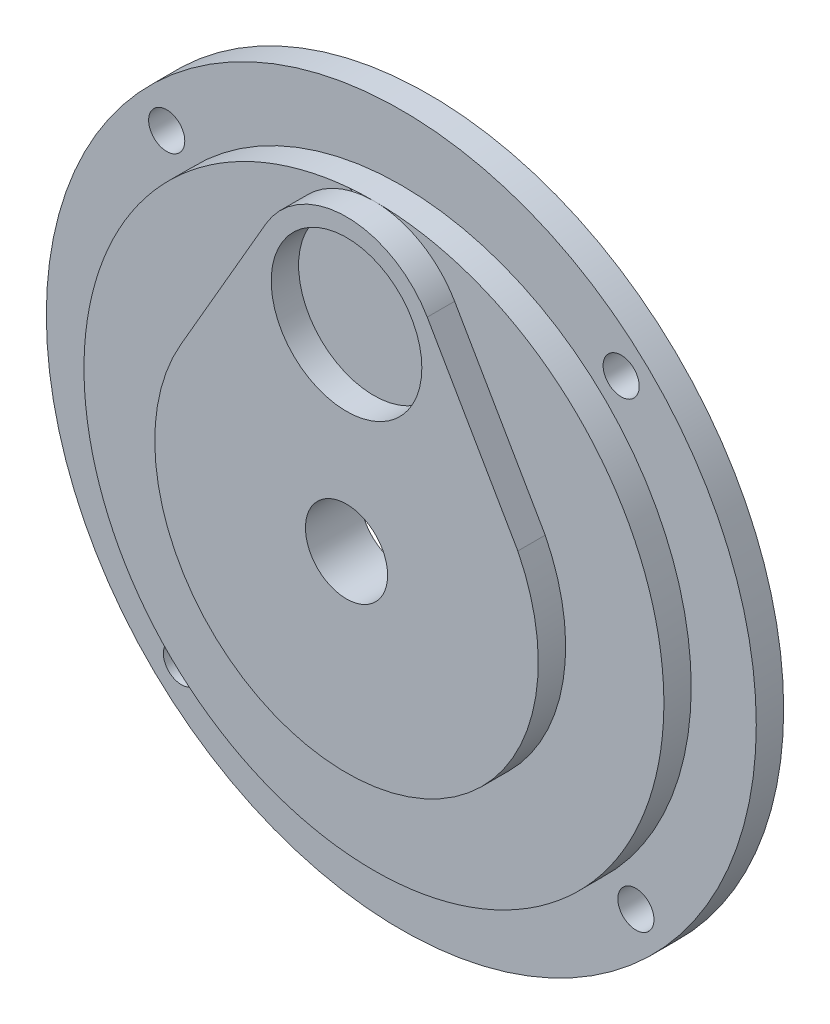
ISO-10303-21;
HEADER;
FILE_DESCRIPTION(('STEP AP214'),'2;1');
FILE_NAME('part.step','',(''),(''),'','','');
FILE_SCHEMA(('AUTOMOTIVE_DESIGN { 1 0 10303 214 1 1 1 1 }'));
ENDSEC;
DATA;
#1=APPLICATION_CONTEXT('core data for automotive mechanical design processes');
#2=APPLICATION_PROTOCOL_DEFINITION('international standard','automotive_design',2000,#1);
#3=PRODUCT_CONTEXT('',#1,'mechanical');
#4=PRODUCT('Part','Part','',(#3));
#5=PRODUCT_RELATED_PRODUCT_CATEGORY('part','',(#4));
#6=PRODUCT_DEFINITION_FORMATION('','',#4);
#7=PRODUCT_DEFINITION_CONTEXT('part definition',#1,'design');
#8=PRODUCT_DEFINITION('design','',#6,#7);
#9=PRODUCT_DEFINITION_SHAPE('','',#8);
#10=(LENGTH_UNIT() NAMED_UNIT(*) SI_UNIT(.MILLI.,.METRE.));
#11=(NAMED_UNIT(*) PLANE_ANGLE_UNIT() SI_UNIT($,.RADIAN.));
#12=(NAMED_UNIT(*) SI_UNIT($,.STERADIAN.) SOLID_ANGLE_UNIT());
#13=UNCERTAINTY_MEASURE_WITH_UNIT(LENGTH_MEASURE(1.E-05),#10,'distance_accuracy_value','');
#14=(GEOMETRIC_REPRESENTATION_CONTEXT(3) GLOBAL_UNCERTAINTY_ASSIGNED_CONTEXT((#13)) GLOBAL_UNIT_ASSIGNED_CONTEXT((#10,
#11,#12)) REPRESENTATION_CONTEXT('',''));
#15=CARTESIAN_POINT('',(0.,0.,0.));
#16=DIRECTION('',(0.,0.,1.));
#17=DIRECTION('',(1.,0.,0.));
#18=AXIS2_PLACEMENT_3D('',#15,#16,#17);
#19=CARTESIAN_POINT('',(-43.6735604962236,22.9437423745675,12.7));
#20=DIRECTION('',(0.,0.,1.));
#21=DIRECTION('',(1.,0.,0.));
#22=AXIS2_PLACEMENT_3D('',#19,#20,#21);
#23=PLANE('',#22);
#24=CARTESIAN_POINT('',(-43.6735604962236,68.5367423745675,12.7));
#25=DIRECTION('',(0.,0.,1.));
#26=DIRECTION('',(1.,0.,0.));
#27=AXIS2_PLACEMENT_3D('',#24,#25,#26);
#28=CIRCLE('',#27,21.6184144908593);
#29=CARTESIAN_POINT('',(-24.9610791172745,79.3625857939543,12.7));
#30=VERTEX_POINT('',#29);
#31=CARTESIAN_POINT('',(-43.6735604962236,90.1551568654268,12.7));
#32=VERTEX_POINT('',#31);
#33=EDGE_CURVE('E47',#30,#32,#28,.T.);
#34=ORIENTED_EDGE('',*,*,#33,.F.);
#35=DIRECTION('',(0.499203683764437,-0.866484669290817,0.));
#36=VECTOR('',#35,1.);
#37=CARTESIAN_POINT('',(15.5878016789929,8.98052590625935,12.7));
#38=LINE('',#37,#36);
#39=CARTESIAN_POINT('',(-3.9627706549981,42.9151136391057,12.7));
#40=VERTEX_POINT('',#39);
#41=EDGE_CURVE('E54',#30,#40,#38,.T.);
#42=ORIENTED_EDGE('',*,*,#41,.T.);
#43=CARTESIAN_POINT('',(-43.6735604962236,22.9437423745675,12.7));
#44=DIRECTION('',(0.,0.,1.));
#45=DIRECTION('',(1.,0.,0.));
#46=AXIS2_PLACEMENT_3D('',#43,#44,#45);
#47=CIRCLE('',#46,44.45);
#48=CARTESIAN_POINT('',(-82.148620618971,45.2029483026991,12.7));
#49=VERTEX_POINT('',#48);
#50=EDGE_CURVE('E59',#49,#40,#47,.T.);
#51=ORIENTED_EDGE('',*,*,#50,.F.);
#52=DIRECTION('',(-0.500769537190813,-0.86558065517992,0.));
#53=VECTOR('',#52,1.);
#54=CARTESIAN_POINT('',(-81.1417087279766,46.9433965320476,12.7));
#55=LINE('',#54,#53);
#56=CARTESIAN_POINT('',(-62.3860418751726,79.3625857939543,12.7));
#57=VERTEX_POINT('',#56);
#58=EDGE_CURVE('E122',#57,#49,#55,.T.);
#59=ORIENTED_EDGE('',*,*,#58,.F.);
#60=EDGE_CURVE('E11',#32,#57,#28,.T.);
#61=ORIENTED_EDGE('',*,*,#60,.F.);
#62=CARTESIAN_POINT('',(-43.6735604962236,22.9437423745675,12.7));
#63=DIRECTION('',(0.,0.,1.));
#64=DIRECTION('',(1.,0.,0.));
#65=AXIS2_PLACEMENT_3D('',#62,#63,#64);
#66=CIRCLE('',#65,67.2114144908593);
#67=EDGE_CURVE('E133',#32,#32,#66,.T.);
#68=ORIENTED_EDGE('',*,*,#67,.T.);
#69=EDGE_LOOP('',(#34,#42,#51,#59,#61,#68));
#70=FACE_BOUND('',#69,.T.);
#71=ADVANCED_FACE('F36',(#70),#23,.T.);
#72=CARTESIAN_POINT('',(-43.6735604962236,22.9437423745675,6.35));
#73=DIRECTION('',(0.,0.,1.));
#74=DIRECTION('',(1.,0.,0.));
#75=AXIS2_PLACEMENT_3D('',#72,#73,#74);
#76=PLANE('',#75);
#77=CARTESIAN_POINT('',(-94.6405270187441,-31.4437780091775,6.35));
#78=DIRECTION('',(0.,0.,1.));
#79=DIRECTION('',(1.,0.,0.));
#80=AXIS2_PLACEMENT_3D('',#77,#78,#79);
#81=CIRCLE('',#80,4.19100000000002);
#82=CARTESIAN_POINT('',(-90.449527018744,-31.4437780091775,6.35));
#83=VERTEX_POINT('',#82);
#84=EDGE_CURVE('E142',#83,#83,#81,.T.);
#85=ORIENTED_EDGE('',*,*,#84,.F.);
#86=EDGE_LOOP('',(#85));
#87=FACE_BOUND('',#86,.T.);
#88=CARTESIAN_POINT('',(7.29340602629695,77.3312627583125,6.35));
#89=DIRECTION('',(0.,0.,1.));
#90=DIRECTION('',(1.,0.,0.));
#91=AXIS2_PLACEMENT_3D('',#88,#89,#90);
#92=CIRCLE('',#91,4.19100000000001);
#93=CARTESIAN_POINT('',(11.484406026297,77.3312627583125,6.35));
#94=VERTEX_POINT('',#93);
#95=EDGE_CURVE('E154',#94,#94,#92,.T.);
#96=ORIENTED_EDGE('',*,*,#95,.F.);
#97=EDGE_LOOP('',(#96));
#98=FACE_BOUND('',#97,.T.);
#99=CARTESIAN_POINT('',(-43.6735604962236,22.9437423745675,6.35));
#100=DIRECTION('',(0.,0.,1.));
#101=DIRECTION('',(1.,0.,0.));
#102=AXIS2_PLACEMENT_3D('',#99,#100,#101);
#103=CIRCLE('',#102,82.296);
#104=CARTESIAN_POINT('',(38.6224395037764,22.9437423745675,6.35));
#105=VERTEX_POINT('',#104);
#106=EDGE_CURVE('E45',#105,#105,#103,.T.);
#107=ORIENTED_EDGE('',*,*,#106,.T.);
#108=EDGE_LOOP('',(#107));
#109=FACE_BOUND('',#108,.T.);
#110=CARTESIAN_POINT('',(-98.0610808799685,73.910708897088,6.35));
#111=DIRECTION('',(0.,0.,1.));
#112=DIRECTION('',(1.,0.,0.));
#113=AXIS2_PLACEMENT_3D('',#110,#111,#112);
#114=CIRCLE('',#113,4.19100000000003);
#115=CARTESIAN_POINT('',(-93.8700808799685,73.910708897088,6.35));
#116=VERTEX_POINT('',#115);
#117=EDGE_CURVE('E160',#116,#116,#114,.T.);
#118=ORIENTED_EDGE('',*,*,#117,.F.);
#119=EDGE_LOOP('',(#118));
#120=FACE_BOUND('',#119,.T.);
#121=CARTESIAN_POINT('',(10.7139598875214,-28.023224147953,6.35));
#122=DIRECTION('',(0.,0.,1.));
#123=DIRECTION('',(1.,0.,0.));
#124=AXIS2_PLACEMENT_3D('',#121,#122,#123);
#125=CIRCLE('',#124,4.19100000000001);
#126=CARTESIAN_POINT('',(14.9049598875214,-28.023224147953,6.35));
#127=VERTEX_POINT('',#126);
#128=EDGE_CURVE('E148',#127,#127,#125,.T.);
#129=ORIENTED_EDGE('',*,*,#128,.F.);
#130=EDGE_LOOP('',(#129));
#131=FACE_BOUND('',#130,.T.);
#132=CARTESIAN_POINT('',(-43.6735604962236,22.9437423745675,6.35));
#133=DIRECTION('',(0.,0.,1.));
#134=DIRECTION('',(1.,0.,0.));
#135=AXIS2_PLACEMENT_3D('',#132,#133,#134);
#136=CIRCLE('',#135,67.2114144908593);
#137=CARTESIAN_POINT('',(23.5378539946357,22.9437423745675,6.35));
#138=VERTEX_POINT('',#137);
#139=EDGE_CURVE('E132',#138,#138,#136,.T.);
#140=ORIENTED_EDGE('',*,*,#139,.F.);
#141=EDGE_LOOP('',(#140));
#142=FACE_BOUND('',#141,.T.);
#143=ADVANCED_FACE('F203',(#87,#98,#109,#120,#131,#142),#76,.T.);
#144=CARTESIAN_POINT('',(-43.6735604962236,22.9437423745675,0.));
#145=DIRECTION('',(0.,0.,1.));
#146=DIRECTION('',(1.,0.,0.));
#147=AXIS2_PLACEMENT_3D('',#144,#145,#146);
#148=PLANE('',#147);
#149=CARTESIAN_POINT('',(10.7139598875214,-28.023224147953,0.));
#150=DIRECTION('',(0.,0.,1.));
#151=DIRECTION('',(1.,0.,0.));
#152=AXIS2_PLACEMENT_3D('',#149,#150,#151);
#153=CIRCLE('',#152,4.19100000000001);
#154=CARTESIAN_POINT('',(14.9049598875214,-28.023224147953,0.));
#155=VERTEX_POINT('',#154);
#156=EDGE_CURVE('E145',#155,#155,#153,.T.);
#157=ORIENTED_EDGE('',*,*,#156,.T.);
#158=EDGE_LOOP('',(#157));
#159=FACE_BOUND('',#158,.T.);
#160=CARTESIAN_POINT('',(-98.0610808799685,73.910708897088,0.));
#161=DIRECTION('',(0.,0.,1.));
#162=DIRECTION('',(1.,0.,0.));
#163=AXIS2_PLACEMENT_3D('',#160,#161,#162);
#164=CIRCLE('',#163,4.19100000000003);
#165=CARTESIAN_POINT('',(-93.8700808799685,73.910708897088,0.));
#166=VERTEX_POINT('',#165);
#167=EDGE_CURVE('E157',#166,#166,#164,.T.);
#168=ORIENTED_EDGE('',*,*,#167,.T.);
#169=EDGE_LOOP('',(#168));
#170=FACE_BOUND('',#169,.T.);
#171=CARTESIAN_POINT('',(-43.6735604962236,22.9437423745675,0.));
#172=DIRECTION('',(0.,0.,1.));
#173=DIRECTION('',(1.,0.,0.));
#174=AXIS2_PLACEMENT_3D('',#171,#172,#173);
#175=CIRCLE('',#174,82.296);
#176=CARTESIAN_POINT('',(38.6224395037764,22.9437423745675,0.));
#177=VERTEX_POINT('',#176);
#178=EDGE_CURVE('E168',#177,#177,#175,.T.);
#179=ORIENTED_EDGE('',*,*,#178,.F.);
#180=EDGE_LOOP('',(#179));
#181=FACE_BOUND('',#180,.T.);
#182=CARTESIAN_POINT('',(-43.6735604962236,22.9437423745675,0.));
#183=DIRECTION('',(0.,0.,1.));
#184=DIRECTION('',(1.,0.,0.));
#185=AXIS2_PLACEMENT_3D('',#182,#183,#184);
#186=CIRCLE('',#185,57.15);
#187=CARTESIAN_POINT('',(13.4764395037764,22.9437423745675,0.));
#188=VERTEX_POINT('',#187);
#189=EDGE_CURVE('E163',#188,#188,#186,.T.);
#190=ORIENTED_EDGE('',*,*,#189,.T.);
#191=EDGE_LOOP('',(#190));
#192=FACE_BOUND('',#191,.T.);
#193=CARTESIAN_POINT('',(7.29340602629695,77.3312627583125,0.));
#194=DIRECTION('',(0.,0.,1.));
#195=DIRECTION('',(1.,0.,0.));
#196=AXIS2_PLACEMENT_3D('',#193,#194,#195);
#197=CIRCLE('',#196,4.19100000000001);
#198=CARTESIAN_POINT('',(11.484406026297,77.3312627583125,0.));
#199=VERTEX_POINT('',#198);
#200=EDGE_CURVE('E151',#199,#199,#197,.T.);
#201=ORIENTED_EDGE('',*,*,#200,.T.);
#202=EDGE_LOOP('',(#201));
#203=FACE_BOUND('',#202,.T.);
#204=CARTESIAN_POINT('',(-94.6405270187441,-31.4437780091775,0.));
#205=DIRECTION('',(0.,0.,1.));
#206=DIRECTION('',(1.,0.,0.));
#207=AXIS2_PLACEMENT_3D('',#204,#205,#206);
#208=CIRCLE('',#207,4.19100000000002);
#209=CARTESIAN_POINT('',(-90.449527018744,-31.4437780091775,0.));
#210=VERTEX_POINT('',#209);
#211=EDGE_CURVE('E141',#210,#210,#208,.T.);
#212=ORIENTED_EDGE('',*,*,#211,.T.);
#213=EDGE_LOOP('',(#212));
#214=FACE_BOUND('',#213,.T.);
#215=ADVANCED_FACE('F209',(#159,#170,#181,#192,#203,#214),#148,.F.);
#216=CARTESIAN_POINT('',(-43.6735604962236,22.9437423745675,6.35));
#217=DIRECTION('',(0.,0.,-1.));
#218=DIRECTION('',(-1.,0.,0.));
#219=AXIS2_PLACEMENT_3D('',#216,#217,#218);
#220=CYLINDRICAL_SURFACE('',#219,82.296);
#221=ORIENTED_EDGE('',*,*,#106,.F.);
#222=EDGE_LOOP('',(#221));
#223=FACE_BOUND('',#222,.T.);
#224=ORIENTED_EDGE('',*,*,#178,.T.);
#225=EDGE_LOOP('',(#224));
#226=FACE_BOUND('',#225,.T.);
#227=ADVANCED_FACE('F38',(#223,#226),#220,.T.);
#228=CARTESIAN_POINT('',(-43.6735604962236,22.9437423745675,6.35));
#229=DIRECTION('',(0.,0.,-1.));
#230=DIRECTION('',(-1.,0.,0.));
#231=AXIS2_PLACEMENT_3D('',#228,#229,#230);
#232=CYLINDRICAL_SURFACE('',#231,57.15);
#233=CARTESIAN_POINT('',(-43.6735604962236,22.9437423745675,6.35));
#234=DIRECTION('',(0.,0.,1.));
#235=DIRECTION('',(1.,0.,0.));
#236=AXIS2_PLACEMENT_3D('',#233,#234,#235);
#237=CIRCLE('',#236,57.15);
#238=CARTESIAN_POINT('',(13.4764395037764,22.9437423745675,6.35));
#239=VERTEX_POINT('',#238);
#240=EDGE_CURVE('E136',#239,#239,#237,.T.);
#241=ORIENTED_EDGE('',*,*,#240,.T.);
#242=EDGE_LOOP('',(#241));
#243=FACE_BOUND('',#242,.T.);
#244=ORIENTED_EDGE('',*,*,#189,.F.);
#245=EDGE_LOOP('',(#244));
#246=FACE_BOUND('',#245,.T.);
#247=ADVANCED_FACE('F276',(#243,#246),#232,.F.);
#248=CARTESIAN_POINT('',(-98.0610808799685,73.910708897088,6.35));
#249=DIRECTION('',(0.,0.,-1.));
#250=DIRECTION('',(-1.,0.,0.));
#251=AXIS2_PLACEMENT_3D('',#248,#249,#250);
#252=CYLINDRICAL_SURFACE('',#251,4.19100000000003);
#253=ORIENTED_EDGE('',*,*,#117,.T.);
#254=EDGE_LOOP('',(#253));
#255=FACE_BOUND('',#254,.T.);
#256=ORIENTED_EDGE('',*,*,#167,.F.);
#257=EDGE_LOOP('',(#256));
#258=FACE_BOUND('',#257,.T.);
#259=ADVANCED_FACE('F272',(#255,#258),#252,.F.);
#260=CARTESIAN_POINT('',(7.29340602629695,77.3312627583125,6.35));
#261=DIRECTION('',(0.,0.,-1.));
#262=DIRECTION('',(-1.,0.,0.));
#263=AXIS2_PLACEMENT_3D('',#260,#261,#262);
#264=CYLINDRICAL_SURFACE('',#263,4.19100000000001);
#265=ORIENTED_EDGE('',*,*,#95,.T.);
#266=EDGE_LOOP('',(#265));
#267=FACE_BOUND('',#266,.T.);
#268=ORIENTED_EDGE('',*,*,#200,.F.);
#269=EDGE_LOOP('',(#268));
#270=FACE_BOUND('',#269,.T.);
#271=ADVANCED_FACE('F268',(#267,#270),#264,.F.);
#272=CARTESIAN_POINT('',(10.7139598875214,-28.023224147953,6.35));
#273=DIRECTION('',(0.,0.,-1.));
#274=DIRECTION('',(-1.,0.,0.));
#275=AXIS2_PLACEMENT_3D('',#272,#273,#274);
#276=CYLINDRICAL_SURFACE('',#275,4.19100000000001);
#277=ORIENTED_EDGE('',*,*,#128,.T.);
#278=EDGE_LOOP('',(#277));
#279=FACE_BOUND('',#278,.T.);
#280=ORIENTED_EDGE('',*,*,#156,.F.);
#281=EDGE_LOOP('',(#280));
#282=FACE_BOUND('',#281,.T.);
#283=ADVANCED_FACE('F262',(#279,#282),#276,.F.);
#284=CARTESIAN_POINT('',(-94.6405270187441,-31.4437780091775,6.35));
#285=DIRECTION('',(0.,0.,-1.));
#286=DIRECTION('',(-1.,0.,0.));
#287=AXIS2_PLACEMENT_3D('',#284,#285,#286);
#288=CYLINDRICAL_SURFACE('',#287,4.19100000000002);
#289=ORIENTED_EDGE('',*,*,#84,.T.);
#290=EDGE_LOOP('',(#289));
#291=FACE_BOUND('',#290,.T.);
#292=ORIENTED_EDGE('',*,*,#211,.F.);
#293=EDGE_LOOP('',(#292));
#294=FACE_BOUND('',#293,.T.);
#295=ADVANCED_FACE('F257',(#291,#294),#288,.F.);
#296=CARTESIAN_POINT('',(-43.6735604962236,22.9437423745675,6.35));
#297=DIRECTION('',(0.,0.,1.));
#298=DIRECTION('',(1.,0.,0.));
#299=AXIS2_PLACEMENT_3D('',#296,#297,#298);
#300=PLANE('',#299);
#301=CARTESIAN_POINT('',(-43.6735604962241,-18.3312576254325,6.35));
#302=DIRECTION('',(0.,0.,1.));
#303=DIRECTION('',(1.,0.,0.));
#304=AXIS2_PLACEMENT_3D('',#301,#302,#303);
#305=CIRCLE('',#304,2.15265);
#306=CARTESIAN_POINT('',(-41.5209104962241,-18.3312576254325,6.35));
#307=VERTEX_POINT('',#306);
#308=EDGE_CURVE('E40',#307,#307,#305,.T.);
#309=ORIENTED_EDGE('',*,*,#308,.T.);
#310=EDGE_LOOP('',(#309));
#311=FACE_BOUND('',#310,.T.);
#312=CARTESIAN_POINT('',(-7.92836195502077,43.5812423745673,6.35));
#313=DIRECTION('',(0.,0.,1.));
#314=DIRECTION('',(1.,0.,0.));
#315=AXIS2_PLACEMENT_3D('',#312,#313,#314);
#316=CIRCLE('',#315,2.16922635633173);
#317=CARTESIAN_POINT('',(-5.75913559868904,43.5812423745673,6.35));
#318=VERTEX_POINT('',#317);
#319=EDGE_CURVE('E175',#318,#318,#316,.T.);
#320=ORIENTED_EDGE('',*,*,#319,.T.);
#321=EDGE_LOOP('',(#320));
#322=FACE_BOUND('',#321,.T.);
#323=CARTESIAN_POINT('',(-79.4187590374262,43.5812423745676,6.35));
#324=DIRECTION('',(0.,0.,1.));
#325=DIRECTION('',(1.,0.,0.));
#326=AXIS2_PLACEMENT_3D('',#323,#324,#325);
#327=CIRCLE('',#326,2.15264999999999);
#328=CARTESIAN_POINT('',(-77.2661090374262,43.5812423745676,6.35));
#329=VERTEX_POINT('',#328);
#330=EDGE_CURVE('E120',#329,#329,#327,.T.);
#331=ORIENTED_EDGE('',*,*,#330,.T.);
#332=EDGE_LOOP('',(#331));
#333=FACE_BOUND('',#332,.T.);
#334=ORIENTED_EDGE('',*,*,#240,.F.);
#335=EDGE_LOOP('',(#334));
#336=FACE_BOUND('',#335,.T.);
#337=CARTESIAN_POINT('',(-43.6735604962236,22.9437423745675,6.35));
#338=DIRECTION('',(0.,0.,1.));
#339=DIRECTION('',(1.,0.,0.));
#340=AXIS2_PLACEMENT_3D('',#337,#338,#339);
#341=CIRCLE('',#340,9.525);
#342=CARTESIAN_POINT('',(-34.1485604962236,22.9437423745675,6.35));
#343=VERTEX_POINT('',#342);
#344=EDGE_CURVE('E89',#343,#343,#341,.T.);
#345=ORIENTED_EDGE('',*,*,#344,.T.);
#346=EDGE_LOOP('',(#345));
#347=FACE_BOUND('',#346,.T.);
#348=ADVANCED_FACE('F249',(#311,#322,#333,#336,#347),#300,.F.);
#349=CARTESIAN_POINT('',(-43.6735604962236,22.9437423745675,12.7));
#350=DIRECTION('',(0.,0.,-1.));
#351=DIRECTION('',(-1.,0.,0.));
#352=AXIS2_PLACEMENT_3D('',#349,#350,#351);
#353=CYLINDRICAL_SURFACE('',#352,67.2114144908593);
#354=ORIENTED_EDGE('',*,*,#67,.F.);
#355=EDGE_LOOP('',(#354));
#356=FACE_BOUND('',#355,.T.);
#357=ORIENTED_EDGE('',*,*,#139,.T.);
#358=EDGE_LOOP('',(#357));
#359=FACE_BOUND('',#358,.T.);
#360=ADVANCED_FACE('F243',(#356,#359),#353,.T.);
#361=CARTESIAN_POINT('',(-43.6735604962236,22.9437423745675,12.7));
#362=DIRECTION('',(0.,0.,-1.));
#363=DIRECTION('',(-1.,0.,0.));
#364=AXIS2_PLACEMENT_3D('',#361,#362,#363);
#365=CYLINDRICAL_SURFACE('',#364,9.525);
#366=ORIENTED_EDGE('',*,*,#344,.F.);
#367=EDGE_LOOP('',(#366));
#368=FACE_BOUND('',#367,.T.);
#369=CARTESIAN_POINT('',(-43.6735604962236,22.9437423745675,19.05));
#370=DIRECTION('',(0.,0.,1.));
#371=DIRECTION('',(1.,0.,0.));
#372=AXIS2_PLACEMENT_3D('',#369,#370,#371);
#373=CIRCLE('',#372,9.525);
#374=CARTESIAN_POINT('',(-34.1485604962236,22.9437423745675,19.05));
#375=VERTEX_POINT('',#374);
#376=EDGE_CURVE('E113',#375,#375,#373,.F.);
#377=ORIENTED_EDGE('',*,*,#376,.F.);
#378=EDGE_LOOP('',(#377));
#379=FACE_BOUND('',#378,.T.);
#380=ADVANCED_FACE('F241',(#368,#379),#365,.F.);
#381=CARTESIAN_POINT('',(15.5878016789929,8.98052590625935,19.05));
#382=DIRECTION('',(0.866484669290817,0.499203683764437,0.));
#383=DIRECTION('',(-0.499203683764437,0.866484669290817,0.));
#384=AXIS2_PLACEMENT_3D('',#381,#382,#383);
#385=PLANE('',#384);
#386=ORIENTED_EDGE('',*,*,#41,.F.);
#387=DIRECTION('',(0.,0.,-1.));
#388=VECTOR('',#387,1.);
#389=CARTESIAN_POINT('',(-24.9610791172745,79.3625857939543,19.05));
#390=LINE('',#389,#388);
#391=CARTESIAN_POINT('',(-24.9610791172745,79.3625857939543,19.05));
#392=VERTEX_POINT('',#391);
#393=EDGE_CURVE('E82',#392,#30,#390,.T.);
#394=ORIENTED_EDGE('',*,*,#393,.F.);
#395=DIRECTION('',(0.499203683764437,-0.866484669290817,0.));
#396=VECTOR('',#395,1.);
#397=CARTESIAN_POINT('',(15.5878016789929,8.98052590625935,19.05));
#398=LINE('',#397,#396);
#399=CARTESIAN_POINT('',(-3.9627706549981,42.9151136391057,19.05));
#400=VERTEX_POINT('',#399);
#401=EDGE_CURVE('E86',#392,#400,#398,.T.);
#402=ORIENTED_EDGE('',*,*,#401,.T.);
#403=DIRECTION('',(0.,0.,-1.));
#404=VECTOR('',#403,1.);
#405=CARTESIAN_POINT('',(-3.9627706549981,42.9151136391057,19.05));
#406=LINE('',#405,#404);
#407=EDGE_CURVE('E116',#400,#40,#406,.T.);
#408=ORIENTED_EDGE('',*,*,#407,.T.);
#409=EDGE_LOOP('',(#386,#394,#402,#408));
#410=FACE_BOUND('',#409,.T.);
#411=ADVANCED_FACE('F84',(#410),#385,.T.);
#412=CARTESIAN_POINT('',(-43.6735604962236,68.5367423745675,19.05));
#413=DIRECTION('',(0.,0.,-1.));
#414=DIRECTION('',(-1.,0.,0.));
#415=AXIS2_PLACEMENT_3D('',#412,#413,#414);
#416=CYLINDRICAL_SURFACE('',#415,21.6184144908593);
#417=ORIENTED_EDGE('',*,*,#33,.T.);
#418=ORIENTED_EDGE('',*,*,#60,.T.);
#419=DIRECTION('',(0.,0.,-1.));
#420=VECTOR('',#419,1.);
#421=CARTESIAN_POINT('',(-62.3860418751726,79.3625857939543,19.05));
#422=LINE('',#421,#420);
#423=CARTESIAN_POINT('',(-62.3860418751726,79.3625857939543,19.05));
#424=VERTEX_POINT('',#423);
#425=EDGE_CURVE('E90',#424,#57,#422,.T.);
#426=ORIENTED_EDGE('',*,*,#425,.F.);
#427=CARTESIAN_POINT('',(-43.6735604962236,68.5367423745675,19.05));
#428=DIRECTION('',(0.,0.,1.));
#429=DIRECTION('',(1.,0.,0.));
#430=AXIS2_PLACEMENT_3D('',#427,#428,#429);
#431=CIRCLE('',#430,21.6184144908593);
#432=EDGE_CURVE('E94',#392,#424,#431,.T.);
#433=ORIENTED_EDGE('',*,*,#432,.F.);
#434=ORIENTED_EDGE('',*,*,#393,.T.);
#435=EDGE_LOOP('',(#417,#418,#426,#433,#434));
#436=FACE_BOUND('',#435,.T.);
#437=ADVANCED_FACE('F95',(#436),#416,.T.);
#438=CARTESIAN_POINT('',(-81.1417087279766,46.9433965320476,19.05));
#439=DIRECTION('',(0.86558065517992,-0.500769537190813,0.));
#440=DIRECTION('',(0.500769537190813,0.86558065517992,0.));
#441=AXIS2_PLACEMENT_3D('',#438,#439,#440);
#442=PLANE('',#441);
#443=ORIENTED_EDGE('',*,*,#58,.T.);
#444=DIRECTION('',(0.,0.,-1.));
#445=VECTOR('',#444,1.);
#446=CARTESIAN_POINT('',(-82.148620618971,45.2029483026991,19.05));
#447=LINE('',#446,#445);
#448=CARTESIAN_POINT('',(-82.148620618971,45.2029483026991,19.05));
#449=VERTEX_POINT('',#448);
#450=EDGE_CURVE('E127',#449,#49,#447,.T.);
#451=ORIENTED_EDGE('',*,*,#450,.F.);
#452=DIRECTION('',(-0.500769537190813,-0.86558065517992,0.));
#453=VECTOR('',#452,1.);
#454=CARTESIAN_POINT('',(-81.1417087279766,46.9433965320476,19.05));
#455=LINE('',#454,#453);
#456=EDGE_CURVE('E99',#424,#449,#455,.T.);
#457=ORIENTED_EDGE('',*,*,#456,.F.);
#458=ORIENTED_EDGE('',*,*,#425,.T.);
#459=EDGE_LOOP('',(#443,#451,#457,#458));
#460=FACE_BOUND('',#459,.T.);
#461=ADVANCED_FACE('F236',(#460),#442,.F.);
#462=CARTESIAN_POINT('',(-43.6735604962236,22.9437423745675,19.05));
#463=DIRECTION('',(0.,0.,-1.));
#464=DIRECTION('',(-1.,0.,0.));
#465=AXIS2_PLACEMENT_3D('',#462,#463,#464);
#466=CYLINDRICAL_SURFACE('',#465,44.45);
#467=ORIENTED_EDGE('',*,*,#50,.T.);
#468=ORIENTED_EDGE('',*,*,#407,.F.);
#469=CARTESIAN_POINT('',(-43.6735604962236,22.9437423745675,19.05));
#470=DIRECTION('',(0.,0.,1.));
#471=DIRECTION('',(1.,0.,0.));
#472=AXIS2_PLACEMENT_3D('',#469,#470,#471);
#473=CIRCLE('',#472,44.45);
#474=EDGE_CURVE('E103',#449,#400,#473,.T.);
#475=ORIENTED_EDGE('',*,*,#474,.F.);
#476=ORIENTED_EDGE('',*,*,#450,.T.);
#477=EDGE_LOOP('',(#467,#468,#475,#476));
#478=FACE_BOUND('',#477,.T.);
#479=ADVANCED_FACE('F230',(#478),#466,.T.);
#480=CARTESIAN_POINT('',(-43.6735604962236,68.5367423745675,19.05));
#481=DIRECTION('',(0.,0.,-1.));
#482=DIRECTION('',(-1.,0.,0.));
#483=AXIS2_PLACEMENT_3D('',#480,#481,#482);
#484=CYLINDRICAL_SURFACE('',#483,17.4625);
#485=CARTESIAN_POINT('',(-43.6735604962236,68.5367423745675,19.05));
#486=DIRECTION('',(0.,0.,1.));
#487=DIRECTION('',(1.,0.,0.));
#488=AXIS2_PLACEMENT_3D('',#485,#486,#487);
#489=CIRCLE('',#488,17.4625);
#490=CARTESIAN_POINT('',(-26.2110604962236,68.5367423745675,19.05));
#491=VERTEX_POINT('',#490);
#492=EDGE_CURVE('E105',#491,#491,#489,.T.);
#493=ORIENTED_EDGE('',*,*,#492,.T.);
#494=EDGE_LOOP('',(#493));
#495=FACE_BOUND('',#494,.T.);
#496=CARTESIAN_POINT('',(-43.6735604962236,68.5367423745675,12.7));
#497=DIRECTION('',(0.,0.,1.));
#498=DIRECTION('',(1.,0.,0.));
#499=AXIS2_PLACEMENT_3D('',#496,#497,#498);
#500=CIRCLE('',#499,17.4625);
#501=CARTESIAN_POINT('',(-26.2110604962236,68.5367423745675,12.7));
#502=VERTEX_POINT('',#501);
#503=EDGE_CURVE('E117',#502,#502,#500,.T.);
#504=ORIENTED_EDGE('',*,*,#503,.F.);
#505=EDGE_LOOP('',(#504));
#506=FACE_BOUND('',#505,.T.);
#507=ADVANCED_FACE('F224',(#495,#506),#484,.F.);
#508=CARTESIAN_POINT('',(0.,0.,19.05));
#509=DIRECTION('',(0.,0.,1.));
#510=DIRECTION('',(1.,0.,0.));
#511=AXIS2_PLACEMENT_3D('',#508,#509,#510);
#512=PLANE('',#511);
#513=ORIENTED_EDGE('',*,*,#492,.F.);
#514=EDGE_LOOP('',(#513));
#515=FACE_BOUND('',#514,.T.);
#516=ORIENTED_EDGE('',*,*,#401,.F.);
#517=ORIENTED_EDGE('',*,*,#432,.T.);
#518=ORIENTED_EDGE('',*,*,#456,.T.);
#519=ORIENTED_EDGE('',*,*,#474,.T.);
#520=EDGE_LOOP('',(#516,#517,#518,#519));
#521=FACE_BOUND('',#520,.T.);
#522=ORIENTED_EDGE('',*,*,#376,.T.);
#523=EDGE_LOOP('',(#522));
#524=FACE_BOUND('',#523,.T.);
#525=ADVANCED_FACE('F101',(#515,#521,#524),#512,.T.);
#526=ORIENTED_EDGE('',*,*,#503,.T.);
#527=EDGE_LOOP('',(#526));
#528=FACE_BOUND('',#527,.T.);
#529=ADVANCED_FACE('F205',(#528),#23,.T.);
#530=CARTESIAN_POINT('',(-79.4187590374262,43.5812423745676,-1.27));
#531=DIRECTION('',(0.,0.,1.));
#532=DIRECTION('',(1.,0.,0.));
#533=AXIS2_PLACEMENT_3D('',#530,#531,#532);
#534=CYLINDRICAL_SURFACE('',#533,2.15264999999999);
#535=CARTESIAN_POINT('',(-79.4187590374262,43.5812423745676,12.7));
#536=DIRECTION('',(0.,0.,1.));
#537=DIRECTION('',(1.,0.,0.));
#538=AXIS2_PLACEMENT_3D('',#535,#536,#537);
#539=CIRCLE('',#538,2.15264999999999);
#540=CARTESIAN_POINT('',(-77.2661090374262,43.5812423745676,12.7));
#541=VERTEX_POINT('',#540);
#542=EDGE_CURVE('E174',#541,#541,#539,.T.);
#543=ORIENTED_EDGE('',*,*,#542,.T.);
#544=EDGE_LOOP('',(#543));
#545=FACE_BOUND('',#544,.T.);
#546=ORIENTED_EDGE('',*,*,#330,.F.);
#547=EDGE_LOOP('',(#546));
#548=FACE_BOUND('',#547,.T.);
#549=ADVANCED_FACE('F215',(#545,#548),#534,.F.);
#550=CARTESIAN_POINT('',(-79.4187590374262,43.5812423745676,12.7));
#551=DIRECTION('',(0.,0.,1.));
#552=DIRECTION('',(1.,0.,0.));
#553=AXIS2_PLACEMENT_3D('',#550,#551,#552);
#554=PLANE('',#553);
#555=ORIENTED_EDGE('',*,*,#542,.F.);
#556=EDGE_LOOP('',(#555));
#557=FACE_BOUND('',#556,.T.);
#558=ADVANCED_FACE('F221',(#557),#554,.F.);
#559=CARTESIAN_POINT('',(-7.92836195502077,43.5812423745673,-1.27));
#560=DIRECTION('',(0.,0.,1.));
#561=DIRECTION('',(1.,0.,0.));
#562=AXIS2_PLACEMENT_3D('',#559,#560,#561);
#563=CYLINDRICAL_SURFACE('',#562,2.16922635633173);
#564=CARTESIAN_POINT('',(-7.92836195502077,43.5812423745673,12.7));
#565=DIRECTION('',(0.,0.,1.));
#566=DIRECTION('',(1.,0.,0.));
#567=AXIS2_PLACEMENT_3D('',#564,#565,#566);
#568=CIRCLE('',#567,2.16922635633173);
#569=CARTESIAN_POINT('',(-5.75913559868904,43.5812423745673,12.7));
#570=VERTEX_POINT('',#569);
#571=EDGE_CURVE('E177',#570,#570,#568,.T.);
#572=ORIENTED_EDGE('',*,*,#571,.T.);
#573=EDGE_LOOP('',(#572));
#574=FACE_BOUND('',#573,.T.);
#575=ORIENTED_EDGE('',*,*,#319,.F.);
#576=EDGE_LOOP('',(#575));
#577=FACE_BOUND('',#576,.T.);
#578=ADVANCED_FACE('F418',(#574,#577),#563,.F.);
#579=CARTESIAN_POINT('',(-7.92836195502077,43.5812423745673,12.7));
#580=DIRECTION('',(0.,0.,1.));
#581=DIRECTION('',(1.,0.,0.));
#582=AXIS2_PLACEMENT_3D('',#579,#580,#581);
#583=PLANE('',#582);
#584=ORIENTED_EDGE('',*,*,#571,.F.);
#585=EDGE_LOOP('',(#584));
#586=FACE_BOUND('',#585,.T.);
#587=ADVANCED_FACE('F200',(#586),#583,.F.);
#588=CARTESIAN_POINT('',(-43.6735604962241,-18.3312576254325,-1.27));
#589=DIRECTION('',(0.,0.,1.));
#590=DIRECTION('',(1.,0.,0.));
#591=AXIS2_PLACEMENT_3D('',#588,#589,#590);
#592=CYLINDRICAL_SURFACE('',#591,2.15265);
#593=CARTESIAN_POINT('',(-43.6735604962241,-18.3312576254325,12.7));
#594=DIRECTION('',(0.,0.,1.));
#595=DIRECTION('',(1.,0.,0.));
#596=AXIS2_PLACEMENT_3D('',#593,#594,#595);
#597=CIRCLE('',#596,2.15265);
#598=CARTESIAN_POINT('',(-41.5209104962241,-18.3312576254325,12.7));
#599=VERTEX_POINT('',#598);
#600=EDGE_CURVE('E186',#599,#599,#597,.T.);
#601=ORIENTED_EDGE('',*,*,#600,.T.);
#602=EDGE_LOOP('',(#601));
#603=FACE_BOUND('',#602,.T.);
#604=ORIENTED_EDGE('',*,*,#308,.F.);
#605=EDGE_LOOP('',(#604));
#606=FACE_BOUND('',#605,.T.);
#607=ADVANCED_FACE('F191',(#603,#606),#592,.F.);
#608=CARTESIAN_POINT('',(-43.6735604962241,-18.3312576254325,12.7));
#609=DIRECTION('',(0.,0.,1.));
#610=DIRECTION('',(1.,0.,0.));
#611=AXIS2_PLACEMENT_3D('',#608,#609,#610);
#612=PLANE('',#611);
#613=ORIENTED_EDGE('',*,*,#600,.F.);
#614=EDGE_LOOP('',(#613));
#615=FACE_BOUND('',#614,.T.);
#616=ADVANCED_FACE('F194',(#615),#612,.F.);
#617=CLOSED_SHELL('',(#71,#143,#215,#227,#247,#259,#271,#283,#295,#348,#360,#380,#411,#437,#461,
#479,#507,#525,#529,#549,#558,#578,#587,#607,#616));
#618=MANIFOLD_SOLID_BREP('B2',#617);
#619=ADVANCED_BREP_SHAPE_REPRESENTATION('',(#18,#618),#14);
#620=SHAPE_DEFINITION_REPRESENTATION(#9,#619);
ENDSEC;
END-ISO-10303-21;
